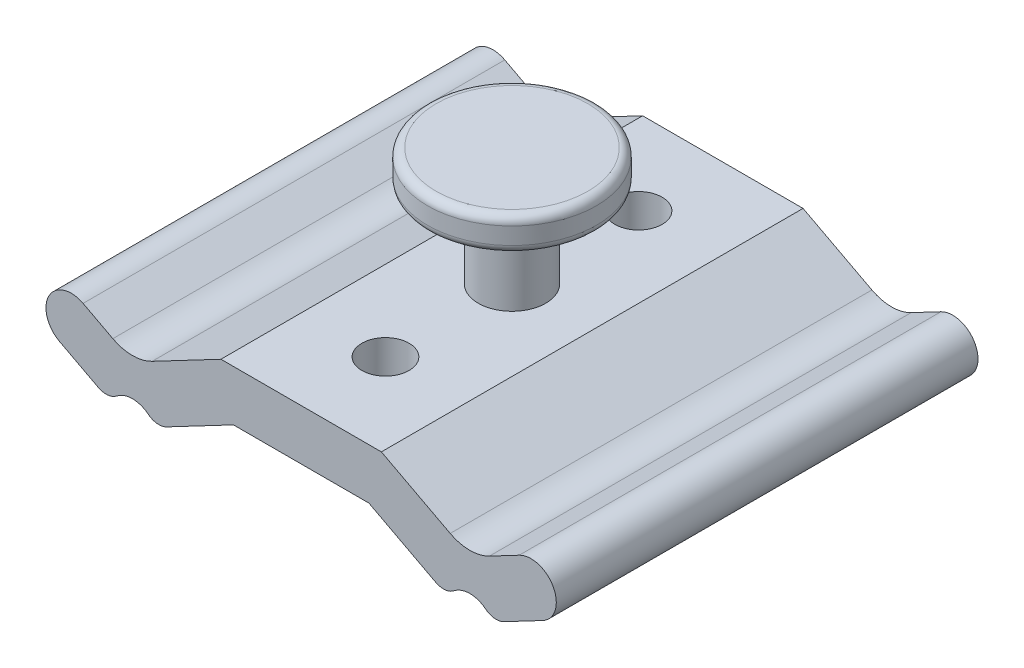
ISO-10303-21;
HEADER;
FILE_DESCRIPTION(('STEP AP214'),'2;1');
FILE_NAME('part.step','',(''),(''),'','','');
FILE_SCHEMA(('AUTOMOTIVE_DESIGN { 1 0 10303 214 1 1 1 1 }'));
ENDSEC;
DATA;
#1=APPLICATION_CONTEXT('core data for automotive mechanical design processes');
#2=APPLICATION_PROTOCOL_DEFINITION('international standard','automotive_design',2000,#1);
#3=PRODUCT_CONTEXT('',#1,'mechanical');
#4=PRODUCT('Part','Part','',(#3));
#5=PRODUCT_RELATED_PRODUCT_CATEGORY('part','',(#4));
#6=PRODUCT_DEFINITION_FORMATION('','',#4);
#7=PRODUCT_DEFINITION_CONTEXT('part definition',#1,'design');
#8=PRODUCT_DEFINITION('design','',#6,#7);
#9=PRODUCT_DEFINITION_SHAPE('','',#8);
#10=(LENGTH_UNIT() NAMED_UNIT(*) SI_UNIT(.MILLI.,.METRE.));
#11=(NAMED_UNIT(*) PLANE_ANGLE_UNIT() SI_UNIT($,.RADIAN.));
#12=(NAMED_UNIT(*) SI_UNIT($,.STERADIAN.) SOLID_ANGLE_UNIT());
#13=UNCERTAINTY_MEASURE_WITH_UNIT(LENGTH_MEASURE(1.E-05),#10,'distance_accuracy_value','');
#14=(GEOMETRIC_REPRESENTATION_CONTEXT(3) GLOBAL_UNCERTAINTY_ASSIGNED_CONTEXT((#13)) GLOBAL_UNIT_ASSIGNED_CONTEXT((#10,
#11,#12)) REPRESENTATION_CONTEXT('',''));
#15=CARTESIAN_POINT('',(0.,0.,0.));
#16=DIRECTION('',(0.,0.,1.));
#17=DIRECTION('',(1.,0.,0.));
#18=AXIS2_PLACEMENT_3D('',#15,#16,#17);
#19=CARTESIAN_POINT('',(27.253463647551,0.907317865991108,-25.));
#20=DIRECTION('',(0.,0.,-1.));
#21=DIRECTION('',(-1.,0.,0.));
#22=AXIS2_PLACEMENT_3D('',#19,#20,#21);
#23=CYLINDRICAL_SURFACE('',#22,3.);
#24=DIRECTION('',(0.,0.,1.));
#25=VECTOR('',#24,1.);
#26=CARTESIAN_POINT('',(28.6507242318909,-1.74742559797116,-25.));
#27=LINE('',#26,#25);
#28=CARTESIAN_POINT('',(28.6507242318909,-1.74742559797116,-25.));
#29=VERTEX_POINT('',#28);
#30=CARTESIAN_POINT('',(28.6507242318909,-1.74742559797116,25.));
#31=VERTEX_POINT('',#30);
#32=EDGE_CURVE('E292',#29,#31,#27,.T.);
#33=ORIENTED_EDGE('',*,*,#32,.F.);
#34=CARTESIAN_POINT('',(27.253463647551,0.907317865991108,-25.));
#35=DIRECTION('',(0.,0.,-1.));
#36=DIRECTION('',(-1.,0.,0.));
#37=AXIS2_PLACEMENT_3D('',#34,#35,#36);
#38=CIRCLE('',#37,3.);
#39=CARTESIAN_POINT('',(25.8562030632112,3.56206132995338,-25.));
#40=VERTEX_POINT('',#39);
#41=EDGE_CURVE('E298',#40,#29,#38,.T.);
#42=ORIENTED_EDGE('',*,*,#41,.F.);
#43=DIRECTION('',(0.,0.,-1.));
#44=VECTOR('',#43,1.);
#45=CARTESIAN_POINT('',(25.8562030632112,3.56206132995337,25.));
#46=LINE('',#45,#44);
#47=CARTESIAN_POINT('',(25.8562030632112,3.56206132995338,25.));
#48=VERTEX_POINT('',#47);
#49=EDGE_CURVE('E295',#48,#40,#46,.T.);
#50=ORIENTED_EDGE('',*,*,#49,.F.);
#51=CARTESIAN_POINT('',(27.253463647551,0.907317865991108,25.));
#52=DIRECTION('',(0.,0.,-1.));
#53=DIRECTION('',(-1.,0.,0.));
#54=AXIS2_PLACEMENT_3D('',#51,#52,#53);
#55=CIRCLE('',#54,3.);
#56=EDGE_CURVE('E301',#31,#48,#55,.F.);
#57=ORIENTED_EDGE('',*,*,#56,.F.);
#58=EDGE_LOOP('',(#33,#42,#50,#57));
#59=FACE_BOUND('',#58,.T.);
#60=ADVANCED_FACE('F36',(#59),#23,.T.);
#61=CARTESIAN_POINT('',(20.,-6.30052692745849,25.));
#62=DIRECTION('',(-0.465753528113271,0.884914487987422,0.));
#63=DIRECTION('',(-0.884914487987422,-0.465753528113271,0.));
#64=AXIS2_PLACEMENT_3D('',#61,#62,#63);
#65=PLANE('',#64);
#66=DIRECTION('',(0.884914487987422,0.465753528113271,0.));
#67=VECTOR('',#66,1.);
#68=CARTESIAN_POINT('',(20.,-6.30052692745849,25.));
#69=LINE('',#68,#67);
#70=CARTESIAN_POINT('',(24.0551876247654,-4.16617612968668,25.));
#71=VERTEX_POINT('',#70);
#72=EDGE_CURVE('E266',#71,#31,#69,.T.);
#73=ORIENTED_EDGE('',*,*,#72,.F.);
#74=DIRECTION('',(0.,0.,1.));
#75=VECTOR('',#74,1.);
#76=CARTESIAN_POINT('',(24.0551876247654,-4.16617612968668,25.));
#77=LINE('',#76,#75);
#78=CARTESIAN_POINT('',(24.0551876247654,-4.16617612968668,-25.));
#79=VERTEX_POINT('',#78);
#80=EDGE_CURVE('E303',#71,#79,#77,.F.);
#81=ORIENTED_EDGE('',*,*,#80,.T.);
#82=DIRECTION('',(0.884914487987422,0.465753528113271,0.));
#83=VECTOR('',#82,1.);
#84=CARTESIAN_POINT('',(20.,-6.30052692745849,-25.));
#85=LINE('',#84,#83);
#86=EDGE_CURVE('E255',#79,#29,#85,.T.);
#87=ORIENTED_EDGE('',*,*,#86,.T.);
#88=ORIENTED_EDGE('',*,*,#32,.T.);
#89=EDGE_LOOP('',(#73,#81,#87,#88));
#90=FACE_BOUND('',#89,.T.);
#91=ADVANCED_FACE('F362',(#90),#65,.F.);
#92=CARTESIAN_POINT('',(17.2054788313204,-0.991039999533956,25.));
#93=DIRECTION('',(-0.465753528113271,0.884914487987422,0.));
#94=DIRECTION('',(-0.884914487987422,-0.465753528113271,0.));
#95=AXIS2_PLACEMENT_3D('',#92,#93,#94);
#96=PLANE('',#95);
#97=DIRECTION('',(0.884914487987422,0.465753528113271,0.));
#98=VECTOR('',#97,1.);
#99=CARTESIAN_POINT('',(17.2054788313204,-0.991039999533956,25.));
#100=LINE('',#99,#98);
#101=CARTESIAN_POINT('',(22.3287676405664,1.70548025280874,25.));
#102=VERTEX_POINT('',#101);
#103=EDGE_CURVE('E268',#102,#48,#100,.T.);
#104=ORIENTED_EDGE('',*,*,#103,.T.);
#105=ORIENTED_EDGE('',*,*,#49,.T.);
#106=DIRECTION('',(0.884914487987422,0.465753528113271,0.));
#107=VECTOR('',#106,1.);
#108=CARTESIAN_POINT('',(17.2054788313204,-0.991039999533956,-25.));
#109=LINE('',#108,#107);
#110=CARTESIAN_POINT('',(22.3287676405664,1.70548025280874,-25.));
#111=VERTEX_POINT('',#110);
#112=EDGE_CURVE('E257',#111,#40,#109,.T.);
#113=ORIENTED_EDGE('',*,*,#112,.F.);
#114=DIRECTION('',(0.,0.,-1.));
#115=VECTOR('',#114,1.);
#116=CARTESIAN_POINT('',(22.3287676405664,1.70548025280874,25.));
#117=LINE('',#116,#115);
#118=EDGE_CURVE('E286',#111,#102,#117,.F.);
#119=ORIENTED_EDGE('',*,*,#118,.T.);
#120=EDGE_LOOP('',(#104,#105,#113,#119));
#121=FACE_BOUND('',#120,.T.);
#122=ADVANCED_FACE('F368',(#121),#96,.T.);
#123=CARTESIAN_POINT('',(10.823752889911,5.30948692792453,25.));
#124=DIRECTION('',(0.465753528113271,0.884914487987422,0.));
#125=DIRECTION('',(-0.884914487987422,0.465753528113271,0.));
#126=AXIS2_PLACEMENT_3D('',#123,#124,#125);
#127=PLANE('',#126);
#128=DIRECTION('',(0.884914487987422,-0.465753528113271,0.));
#129=VECTOR('',#128,1.);
#130=CARTESIAN_POINT('',(10.823752889911,5.30948692792453,25.));
#131=LINE('',#130,#129);
#132=CARTESIAN_POINT('',(9.51180357607636,6.,25.));
#133=VERTEX_POINT('',#132);
#134=CARTESIAN_POINT('',(17.6712323594336,1.70548025280874,25.));
#135=VERTEX_POINT('',#134);
#136=EDGE_CURVE('E271',#133,#135,#131,.T.);
#137=ORIENTED_EDGE('',*,*,#136,.T.);
#138=DIRECTION('',(0.,0.,-1.));
#139=VECTOR('',#138,1.);
#140=CARTESIAN_POINT('',(17.6712323594336,1.70548025280874,-25.));
#141=LINE('',#140,#139);
#142=CARTESIAN_POINT('',(17.6712323594336,1.70548025280874,-25.));
#143=VERTEX_POINT('',#142);
#144=EDGE_CURVE('E283',#135,#143,#141,.T.);
#145=ORIENTED_EDGE('',*,*,#144,.T.);
#146=DIRECTION('',(0.884914487987422,-0.465753528113271,0.));
#147=VECTOR('',#146,1.);
#148=CARTESIAN_POINT('',(10.823752889911,5.30948692792453,-25.));
#149=LINE('',#148,#147);
#150=CARTESIAN_POINT('',(9.51180357607636,6.,-25.));
#151=VERTEX_POINT('',#150);
#152=EDGE_CURVE('E186',#151,#143,#149,.T.);
#153=ORIENTED_EDGE('',*,*,#152,.F.);
#154=DIRECTION('',(0.,0.,-1.));
#155=VECTOR('',#154,1.);
#156=CARTESIAN_POINT('',(9.51180357607636,6.,25.));
#157=LINE('',#156,#155);
#158=EDGE_CURVE('E181',#133,#151,#157,.T.);
#159=ORIENTED_EDGE('',*,*,#158,.F.);
#160=EDGE_LOOP('',(#137,#145,#153,#159));
#161=FACE_BOUND('',#160,.T.);
#162=ADVANCED_FACE('F469',(#161),#127,.T.);
#163=CARTESIAN_POINT('',(0.,6.,25.));
#164=DIRECTION('',(0.,1.,0.));
#165=DIRECTION('',(-1.,0.,0.));
#166=AXIS2_PLACEMENT_3D('',#163,#164,#165);
#167=PLANE('',#166);
#168=CARTESIAN_POINT('',(0.,6.,0.));
#169=DIRECTION('',(0.,1.,0.));
#170=DIRECTION('',(-1.,0.,0.));
#171=AXIS2_PLACEMENT_3D('',#168,#169,#170);
#172=CIRCLE('',#171,4.);
#173=CARTESIAN_POINT('',(-4.,6.,0.));
#174=VERTEX_POINT('',#173);
#175=EDGE_CURVE('E319',#174,#174,#172,.T.);
#176=ORIENTED_EDGE('',*,*,#175,.F.);
#177=EDGE_LOOP('',(#176));
#178=FACE_BOUND('',#177,.T.);
#179=CARTESIAN_POINT('',(0.,6.,-15.));
#180=DIRECTION('',(0.,1.,0.));
#181=DIRECTION('',(0.,0.,1.));
#182=AXIS2_PLACEMENT_3D('',#179,#180,#181);
#183=CIRCLE('',#182,2.80000000000001);
#184=CARTESIAN_POINT('',(0.,6.,-12.2));
#185=VERTEX_POINT('',#184);
#186=EDGE_CURVE('E324',#185,#185,#183,.T.);
#187=ORIENTED_EDGE('',*,*,#186,.F.);
#188=EDGE_LOOP('',(#187));
#189=FACE_BOUND('',#188,.T.);
#190=CARTESIAN_POINT('',(0.,6.,15.));
#191=DIRECTION('',(0.,1.,0.));
#192=DIRECTION('',(0.,0.,1.));
#193=AXIS2_PLACEMENT_3D('',#190,#191,#192);
#194=CIRCLE('',#193,2.80000000000001);
#195=CARTESIAN_POINT('',(0.,6.,17.8));
#196=VERTEX_POINT('',#195);
#197=EDGE_CURVE('E323',#196,#196,#194,.T.);
#198=ORIENTED_EDGE('',*,*,#197,.F.);
#199=EDGE_LOOP('',(#198));
#200=FACE_BOUND('',#199,.T.);
#201=ORIENTED_EDGE('',*,*,#158,.T.);
#202=DIRECTION('',(1.,0.,0.));
#203=VECTOR('',#202,1.);
#204=CARTESIAN_POINT('',(0.,6.,-25.));
#205=LINE('',#204,#203);
#206=CARTESIAN_POINT('',(-9.51180357607636,6.,-25.));
#207=VERTEX_POINT('',#206);
#208=EDGE_CURVE('E174',#207,#151,#205,.T.);
#209=ORIENTED_EDGE('',*,*,#208,.F.);
#210=DIRECTION('',(0.,0.,-1.));
#211=VECTOR('',#210,1.);
#212=CARTESIAN_POINT('',(-9.51180357607636,6.,25.));
#213=LINE('',#212,#211);
#214=CARTESIAN_POINT('',(-9.51180357607636,6.,25.));
#215=VERTEX_POINT('',#214);
#216=EDGE_CURVE('E179',#215,#207,#213,.T.);
#217=ORIENTED_EDGE('',*,*,#216,.F.);
#218=DIRECTION('',(1.,0.,0.));
#219=VECTOR('',#218,1.);
#220=CARTESIAN_POINT('',(0.,6.,25.));
#221=LINE('',#220,#219);
#222=EDGE_CURVE('E274',#215,#133,#221,.T.);
#223=ORIENTED_EDGE('',*,*,#222,.T.);
#224=EDGE_LOOP('',(#201,#209,#217,#223));
#225=FACE_BOUND('',#224,.T.);
#226=ADVANCED_FACE('F176',(#178,#189,#200,#225),#167,.T.);
#227=CARTESIAN_POINT('',(0.,0.,25.));
#228=DIRECTION('',(0.,1.,0.));
#229=DIRECTION('',(-1.,0.,0.));
#230=AXIS2_PLACEMENT_3D('',#227,#228,#229);
#231=PLANE('',#230);
#232=CARTESIAN_POINT('',(0.,0.,-15.));
#233=DIRECTION('',(0.,1.,0.));
#234=DIRECTION('',(-1.,0.,0.));
#235=AXIS2_PLACEMENT_3D('',#232,#233,#234);
#236=CIRCLE('',#235,2.80000000000001);
#237=CARTESIAN_POINT('',(-2.80000000000002,0.,-15.));
#238=VERTEX_POINT('',#237);
#239=EDGE_CURVE('E320',#238,#238,#236,.T.);
#240=ORIENTED_EDGE('',*,*,#239,.T.);
#241=EDGE_LOOP('',(#240));
#242=FACE_BOUND('',#241,.T.);
#243=CARTESIAN_POINT('',(0.,0.,15.));
#244=DIRECTION('',(0.,1.,0.));
#245=DIRECTION('',(-1.,0.,0.));
#246=AXIS2_PLACEMENT_3D('',#243,#244,#245);
#247=CIRCLE('',#246,2.80000000000001);
#248=CARTESIAN_POINT('',(-2.80000000000001,0.,15.));
#249=VERTEX_POINT('',#248);
#250=EDGE_CURVE('E413',#249,#249,#247,.T.);
#251=ORIENTED_EDGE('',*,*,#250,.T.);
#252=EDGE_LOOP('',(#251));
#253=FACE_BOUND('',#252,.T.);
#254=DIRECTION('',(1.,0.,0.));
#255=VECTOR('',#254,1.);
#256=CARTESIAN_POINT('',(0.,0.,25.));
#257=LINE('',#256,#255);
#258=CARTESIAN_POINT('',(-8.02923172123142,0.,25.));
#259=VERTEX_POINT('',#258);
#260=CARTESIAN_POINT('',(8.02923172123142,0.,25.));
#261=VERTEX_POINT('',#260);
#262=EDGE_CURVE('E276',#259,#261,#257,.T.);
#263=ORIENTED_EDGE('',*,*,#262,.F.);
#264=DIRECTION('',(0.,0.,-1.));
#265=VECTOR('',#264,1.);
#266=CARTESIAN_POINT('',(-8.02923172123142,0.,25.));
#267=LINE('',#266,#265);
#268=CARTESIAN_POINT('',(-8.02923172123142,0.,-25.));
#269=VERTEX_POINT('',#268);
#270=EDGE_CURVE('E204',#259,#269,#267,.T.);
#271=ORIENTED_EDGE('',*,*,#270,.T.);
#272=DIRECTION('',(1.,0.,0.));
#273=VECTOR('',#272,1.);
#274=CARTESIAN_POINT('',(0.,0.,-25.));
#275=LINE('',#274,#273);
#276=CARTESIAN_POINT('',(8.02923172123142,0.,-25.));
#277=VERTEX_POINT('',#276);
#278=EDGE_CURVE('E185',#269,#277,#275,.T.);
#279=ORIENTED_EDGE('',*,*,#278,.T.);
#280=DIRECTION('',(0.,0.,-1.));
#281=VECTOR('',#280,1.);
#282=CARTESIAN_POINT('',(8.02923172123142,0.,25.));
#283=LINE('',#282,#281);
#284=EDGE_CURVE('E280',#261,#277,#283,.T.);
#285=ORIENTED_EDGE('',*,*,#284,.F.);
#286=EDGE_LOOP('',(#263,#271,#279,#285));
#287=FACE_BOUND('',#286,.T.);
#288=ADVANCED_FACE('F448',(#242,#253,#287),#231,.F.);
#289=CARTESIAN_POINT('',(8.02923172123142,0.,25.));
#290=DIRECTION('',(0.465753528113271,0.884914487987422,0.));
#291=DIRECTION('',(-0.884914487987422,0.465753528113271,0.));
#292=AXIS2_PLACEMENT_3D('',#289,#290,#291);
#293=PLANE('',#292);
#294=DIRECTION('',(0.884914487987422,-0.465753528113271,0.));
#295=VECTOR('',#294,1.);
#296=CARTESIAN_POINT('',(8.02923172123142,0.,-25.));
#297=LINE('',#296,#295);
#298=CARTESIAN_POINT('',(15.9448123752346,-4.16617612968668,-25.));
#299=VERTEX_POINT('',#298);
#300=EDGE_CURVE('E263',#277,#299,#297,.T.);
#301=ORIENTED_EDGE('',*,*,#300,.T.);
#302=DIRECTION('',(0.,0.,1.));
#303=VECTOR('',#302,1.);
#304=CARTESIAN_POINT('',(15.9448123752346,-4.16617612968668,25.));
#305=LINE('',#304,#303);
#306=CARTESIAN_POINT('',(15.9448123752346,-4.16617612968668,25.));
#307=VERTEX_POINT('',#306);
#308=EDGE_CURVE('E317',#299,#307,#305,.T.);
#309=ORIENTED_EDGE('',*,*,#308,.T.);
#310=DIRECTION('',(0.884914487987422,-0.465753528113271,0.));
#311=VECTOR('',#310,1.);
#312=CARTESIAN_POINT('',(8.02923172123142,0.,25.));
#313=LINE('',#312,#311);
#314=EDGE_CURVE('E278',#261,#307,#313,.T.);
#315=ORIENTED_EDGE('',*,*,#314,.F.);
#316=ORIENTED_EDGE('',*,*,#284,.T.);
#317=EDGE_LOOP('',(#301,#309,#315,#316));
#318=FACE_BOUND('',#317,.T.);
#319=ADVANCED_FACE('F451',(#318),#293,.F.);
#320=CARTESIAN_POINT('',(0.,0.,25.));
#321=DIRECTION('',(0.,0.,-1.));
#322=DIRECTION('',(-1.,0.,0.));
#323=AXIS2_PLACEMENT_3D('',#320,#321,#322);
#324=PLANE('',#323);
#325=CARTESIAN_POINT('',(20.,-6.30052692745849,25.));
#326=DIRECTION('',(0.,0.,1.));
#327=DIRECTION('',(1.,0.,0.));
#328=AXIS2_PLACEMENT_3D('',#325,#326,#327);
#329=CIRCLE('',#328,3.);
#330=CARTESIAN_POINT('',(21.8742083411233,-3.9580190632105,25.));
#331=VERTEX_POINT('',#330);
#332=CARTESIAN_POINT('',(18.1257916588767,-3.9580190632105,25.));
#333=VERTEX_POINT('',#332);
#334=EDGE_CURVE('E250',#331,#333,#329,.T.);
#335=ORIENTED_EDGE('',*,*,#334,.F.);
#336=CARTESIAN_POINT('',(23.1236805685389,-2.39634715371184,25.));
#337=DIRECTION('',(0.,0.,-1.));
#338=DIRECTION('',(-1.,0.,0.));
#339=AXIS2_PLACEMENT_3D('',#336,#337,#338);
#340=CIRCLE('',#339,2.);
#341=EDGE_CURVE('E315',#331,#71,#340,.F.);
#342=ORIENTED_EDGE('',*,*,#341,.T.);
#343=ORIENTED_EDGE('',*,*,#72,.T.);
#344=ORIENTED_EDGE('',*,*,#56,.T.);
#345=ORIENTED_EDGE('',*,*,#103,.F.);
#346=CARTESIAN_POINT('',(20.,6.13005269274585,25.));
#347=DIRECTION('',(0.,0.,-1.));
#348=DIRECTION('',(-1.,0.,0.));
#349=AXIS2_PLACEMENT_3D('',#346,#347,#348);
#350=CIRCLE('',#349,5.);
#351=EDGE_CURVE('E290',#102,#135,#350,.T.);
#352=ORIENTED_EDGE('',*,*,#351,.T.);
#353=ORIENTED_EDGE('',*,*,#136,.F.);
#354=ORIENTED_EDGE('',*,*,#222,.F.);
#355=DIRECTION('',(-0.884914487987422,-0.465753528113271,0.));
#356=VECTOR('',#355,1.);
#357=CARTESIAN_POINT('',(-10.823752889911,5.30948692792453,25.));
#358=LINE('',#357,#356);
#359=CARTESIAN_POINT('',(-17.6712323594336,1.70548025280874,25.));
#360=VERTEX_POINT('',#359);
#361=EDGE_CURVE('E202',#215,#360,#358,.T.);
#362=ORIENTED_EDGE('',*,*,#361,.T.);
#363=CARTESIAN_POINT('',(-20.,6.13005269274585,25.));
#364=DIRECTION('',(0.,0.,1.));
#365=DIRECTION('',(1.,0.,0.));
#366=AXIS2_PLACEMENT_3D('',#363,#364,#365);
#367=CIRCLE('',#366,5.);
#368=CARTESIAN_POINT('',(-22.3287676405664,1.70548025280874,25.));
#369=VERTEX_POINT('',#368);
#370=EDGE_CURVE('E216',#369,#360,#367,.T.);
#371=ORIENTED_EDGE('',*,*,#370,.F.);
#372=DIRECTION('',(-0.884914487987422,0.465753528113271,0.));
#373=VECTOR('',#372,1.);
#374=CARTESIAN_POINT('',(-17.2054788313204,-0.991039999533956,25.));
#375=LINE('',#374,#373);
#376=CARTESIAN_POINT('',(-25.8562030632112,3.56206132995338,25.));
#377=VERTEX_POINT('',#376);
#378=EDGE_CURVE('E429',#369,#377,#375,.T.);
#379=ORIENTED_EDGE('',*,*,#378,.T.);
#380=CARTESIAN_POINT('',(-27.253463647551,0.907317865991108,25.));
#381=DIRECTION('',(0.,0.,1.));
#382=DIRECTION('',(1.,0.,0.));
#383=AXIS2_PLACEMENT_3D('',#380,#381,#382);
#384=CIRCLE('',#383,3.);
#385=CARTESIAN_POINT('',(-28.6507242318909,-1.74742559797116,25.));
#386=VERTEX_POINT('',#385);
#387=EDGE_CURVE('E227',#386,#377,#384,.F.);
#388=ORIENTED_EDGE('',*,*,#387,.F.);
#389=DIRECTION('',(-0.884914487987422,0.465753528113271,0.));
#390=VECTOR('',#389,1.);
#391=CARTESIAN_POINT('',(-20.,-6.30052692745849,25.));
#392=LINE('',#391,#390);
#393=CARTESIAN_POINT('',(-24.0551876247654,-4.16617612968668,25.));
#394=VERTEX_POINT('',#393);
#395=EDGE_CURVE('E427',#394,#386,#392,.T.);
#396=ORIENTED_EDGE('',*,*,#395,.F.);
#397=CARTESIAN_POINT('',(-23.1236805685389,-2.39634715371184,25.));
#398=DIRECTION('',(0.,0.,1.));
#399=DIRECTION('',(1.,0.,0.));
#400=AXIS2_PLACEMENT_3D('',#397,#398,#399);
#401=CIRCLE('',#400,2.);
#402=CARTESIAN_POINT('',(-21.8742083411233,-3.9580190632105,25.));
#403=VERTEX_POINT('',#402);
#404=EDGE_CURVE('E245',#403,#394,#401,.F.);
#405=ORIENTED_EDGE('',*,*,#404,.F.);
#406=CARTESIAN_POINT('',(-20.,-6.30052692745849,25.));
#407=DIRECTION('',(0.,0.,-1.));
#408=DIRECTION('',(-1.,0.,0.));
#409=AXIS2_PLACEMENT_3D('',#406,#407,#408);
#410=CIRCLE('',#409,3.);
#411=CARTESIAN_POINT('',(-18.1257916588767,-3.9580190632105,25.));
#412=VERTEX_POINT('',#411);
#413=EDGE_CURVE('E416',#403,#412,#410,.T.);
#414=ORIENTED_EDGE('',*,*,#413,.T.);
#415=CARTESIAN_POINT('',(-16.8763194314611,-2.39634715371184,25.));
#416=DIRECTION('',(0.,0.,1.));
#417=DIRECTION('',(1.,0.,0.));
#418=AXIS2_PLACEMENT_3D('',#415,#416,#417);
#419=CIRCLE('',#418,2.);
#420=CARTESIAN_POINT('',(-15.9448123752346,-4.16617612968668,25.));
#421=VERTEX_POINT('',#420);
#422=EDGE_CURVE('E242',#421,#412,#419,.F.);
#423=ORIENTED_EDGE('',*,*,#422,.F.);
#424=DIRECTION('',(-0.884914487987422,-0.465753528113271,0.));
#425=VECTOR('',#424,1.);
#426=CARTESIAN_POINT('',(-8.02923172123142,0.,25.));
#427=LINE('',#426,#425);
#428=EDGE_CURVE('E209',#259,#421,#427,.T.);
#429=ORIENTED_EDGE('',*,*,#428,.F.);
#430=ORIENTED_EDGE('',*,*,#262,.T.);
#431=ORIENTED_EDGE('',*,*,#314,.T.);
#432=CARTESIAN_POINT('',(16.8763194314611,-2.39634715371184,25.));
#433=DIRECTION('',(0.,0.,-1.));
#434=DIRECTION('',(-1.,0.,0.));
#435=AXIS2_PLACEMENT_3D('',#432,#433,#434);
#436=CIRCLE('',#435,2.);
#437=EDGE_CURVE('E51',#307,#333,#436,.F.);
#438=ORIENTED_EDGE('',*,*,#437,.T.);
#439=EDGE_LOOP('',(#335,#342,#343,#344,#345,#352,#353,#354,#362,#371,#379,#388,#396,#405,#414,
#423,#429,#430,#431,#438));
#440=FACE_BOUND('',#439,.T.);
#441=ADVANCED_FACE('F438',(#440),#324,.F.);
#442=CARTESIAN_POINT('',(0.,0.,-25.));
#443=DIRECTION('',(0.,0.,-1.));
#444=DIRECTION('',(-1.,0.,0.));
#445=AXIS2_PLACEMENT_3D('',#442,#443,#444);
#446=PLANE('',#445);
#447=ORIENTED_EDGE('',*,*,#86,.F.);
#448=CARTESIAN_POINT('',(23.1236805685389,-2.39634715371184,-25.));
#449=DIRECTION('',(0.,0.,-1.));
#450=DIRECTION('',(-1.,0.,0.));
#451=AXIS2_PLACEMENT_3D('',#448,#449,#450);
#452=CIRCLE('',#451,2.);
#453=CARTESIAN_POINT('',(21.8742083411233,-3.9580190632105,-25.));
#454=VERTEX_POINT('',#453);
#455=EDGE_CURVE('E308',#79,#454,#452,.T.);
#456=ORIENTED_EDGE('',*,*,#455,.T.);
#457=CARTESIAN_POINT('',(20.,-6.30052692745849,-25.));
#458=DIRECTION('',(0.,0.,1.));
#459=DIRECTION('',(1.,0.,0.));
#460=AXIS2_PLACEMENT_3D('',#457,#458,#459);
#461=CIRCLE('',#460,3.);
#462=CARTESIAN_POINT('',(18.1257916588767,-3.9580190632105,-25.));
#463=VERTEX_POINT('',#462);
#464=EDGE_CURVE('E252',#454,#463,#461,.T.);
#465=ORIENTED_EDGE('',*,*,#464,.T.);
#466=CARTESIAN_POINT('',(16.8763194314611,-2.39634715371184,-25.));
#467=DIRECTION('',(0.,0.,-1.));
#468=DIRECTION('',(-1.,0.,0.));
#469=AXIS2_PLACEMENT_3D('',#466,#467,#468);
#470=CIRCLE('',#469,2.);
#471=EDGE_CURVE('E306',#463,#299,#470,.T.);
#472=ORIENTED_EDGE('',*,*,#471,.T.);
#473=ORIENTED_EDGE('',*,*,#300,.F.);
#474=ORIENTED_EDGE('',*,*,#278,.F.);
#475=DIRECTION('',(-0.884914487987422,-0.465753528113271,0.));
#476=VECTOR('',#475,1.);
#477=CARTESIAN_POINT('',(-8.02923172123142,0.,-25.));
#478=LINE('',#477,#476);
#479=CARTESIAN_POINT('',(-15.9448123752346,-4.16617612968668,-25.));
#480=VERTEX_POINT('',#479);
#481=EDGE_CURVE('E197',#269,#480,#478,.T.);
#482=ORIENTED_EDGE('',*,*,#481,.T.);
#483=CARTESIAN_POINT('',(-16.8763194314611,-2.39634715371184,-25.));
#484=DIRECTION('',(0.,0.,1.));
#485=DIRECTION('',(1.,0.,0.));
#486=AXIS2_PLACEMENT_3D('',#483,#484,#485);
#487=CIRCLE('',#486,2.);
#488=CARTESIAN_POINT('',(-18.1257916588767,-3.9580190632105,-25.));
#489=VERTEX_POINT('',#488);
#490=EDGE_CURVE('E233',#489,#480,#487,.T.);
#491=ORIENTED_EDGE('',*,*,#490,.F.);
#492=CARTESIAN_POINT('',(-20.,-6.30052692745849,-25.));
#493=DIRECTION('',(0.,0.,-1.));
#494=DIRECTION('',(-1.,0.,0.));
#495=AXIS2_PLACEMENT_3D('',#492,#493,#494);
#496=CIRCLE('',#495,3.);
#497=CARTESIAN_POINT('',(-21.8742083411233,-3.9580190632105,-25.));
#498=VERTEX_POINT('',#497);
#499=EDGE_CURVE('E419',#498,#489,#496,.T.);
#500=ORIENTED_EDGE('',*,*,#499,.F.);
#501=CARTESIAN_POINT('',(-23.1236805685389,-2.39634715371184,-25.));
#502=DIRECTION('',(0.,0.,1.));
#503=DIRECTION('',(1.,0.,0.));
#504=AXIS2_PLACEMENT_3D('',#501,#502,#503);
#505=CIRCLE('',#504,2.);
#506=CARTESIAN_POINT('',(-24.0551876247654,-4.16617612968668,-25.));
#507=VERTEX_POINT('',#506);
#508=EDGE_CURVE('E235',#507,#498,#505,.T.);
#509=ORIENTED_EDGE('',*,*,#508,.F.);
#510=DIRECTION('',(-0.884914487987422,0.465753528113271,0.));
#511=VECTOR('',#510,1.);
#512=CARTESIAN_POINT('',(-20.,-6.30052692745849,-25.));
#513=LINE('',#512,#511);
#514=CARTESIAN_POINT('',(-28.6507242318909,-1.74742559797116,-25.));
#515=VERTEX_POINT('',#514);
#516=EDGE_CURVE('E422',#507,#515,#513,.T.);
#517=ORIENTED_EDGE('',*,*,#516,.T.);
#518=CARTESIAN_POINT('',(-27.253463647551,0.907317865991108,-25.));
#519=DIRECTION('',(0.,0.,1.));
#520=DIRECTION('',(1.,0.,0.));
#521=AXIS2_PLACEMENT_3D('',#518,#519,#520);
#522=CIRCLE('',#521,3.);
#523=CARTESIAN_POINT('',(-25.8562030632112,3.56206132995338,-25.));
#524=VERTEX_POINT('',#523);
#525=EDGE_CURVE('E224',#524,#515,#522,.T.);
#526=ORIENTED_EDGE('',*,*,#525,.F.);
#527=DIRECTION('',(-0.884914487987422,0.465753528113271,0.));
#528=VECTOR('',#527,1.);
#529=CARTESIAN_POINT('',(-17.2054788313204,-0.991039999533956,-25.));
#530=LINE('',#529,#528);
#531=CARTESIAN_POINT('',(-22.3287676405664,1.70548025280874,-25.));
#532=VERTEX_POINT('',#531);
#533=EDGE_CURVE('E198',#532,#524,#530,.T.);
#534=ORIENTED_EDGE('',*,*,#533,.F.);
#535=CARTESIAN_POINT('',(-20.,6.13005269274585,-25.));
#536=DIRECTION('',(0.,0.,1.));
#537=DIRECTION('',(1.,0.,0.));
#538=AXIS2_PLACEMENT_3D('',#535,#536,#537);
#539=CIRCLE('',#538,5.);
#540=CARTESIAN_POINT('',(-17.6712323594336,1.70548025280874,-25.));
#541=VERTEX_POINT('',#540);
#542=EDGE_CURVE('E193',#541,#532,#539,.F.);
#543=ORIENTED_EDGE('',*,*,#542,.F.);
#544=DIRECTION('',(-0.884914487987422,-0.465753528113271,0.));
#545=VECTOR('',#544,1.);
#546=CARTESIAN_POINT('',(-10.823752889911,5.30948692792453,-25.));
#547=LINE('',#546,#545);
#548=EDGE_CURVE('E189',#207,#541,#547,.T.);
#549=ORIENTED_EDGE('',*,*,#548,.F.);
#550=ORIENTED_EDGE('',*,*,#208,.T.);
#551=ORIENTED_EDGE('',*,*,#152,.T.);
#552=CARTESIAN_POINT('',(20.,6.13005269274585,-25.));
#553=DIRECTION('',(0.,0.,-1.));
#554=DIRECTION('',(-1.,0.,0.));
#555=AXIS2_PLACEMENT_3D('',#552,#553,#554);
#556=CIRCLE('',#555,5.);
#557=EDGE_CURVE('E288',#143,#111,#556,.F.);
#558=ORIENTED_EDGE('',*,*,#557,.T.);
#559=ORIENTED_EDGE('',*,*,#112,.T.);
#560=ORIENTED_EDGE('',*,*,#41,.T.);
#561=EDGE_LOOP('',(#447,#456,#465,#472,#473,#474,#482,#491,#500,#509,#517,#526,#534,#543,#549,
#550,#551,#558,#559,#560));
#562=FACE_BOUND('',#561,.T.);
#563=ADVANCED_FACE('F191',(#562),#446,.T.);
#564=CARTESIAN_POINT('',(20.,6.13005269274585,25.));
#565=DIRECTION('',(0.,0.,1.));
#566=DIRECTION('',(1.,0.,0.));
#567=AXIS2_PLACEMENT_3D('',#564,#565,#566);
#568=CYLINDRICAL_SURFACE('',#567,5.);
#569=ORIENTED_EDGE('',*,*,#351,.F.);
#570=ORIENTED_EDGE('',*,*,#118,.F.);
#571=ORIENTED_EDGE('',*,*,#557,.F.);
#572=ORIENTED_EDGE('',*,*,#144,.F.);
#573=EDGE_LOOP('',(#569,#570,#571,#572));
#574=FACE_BOUND('',#573,.T.);
#575=ADVANCED_FACE('F377',(#574),#568,.F.);
#576=CARTESIAN_POINT('',(20.,-6.30052692745849,-25.));
#577=DIRECTION('',(0.,0.,1.));
#578=DIRECTION('',(1.,0.,0.));
#579=AXIS2_PLACEMENT_3D('',#576,#577,#578);
#580=CYLINDRICAL_SURFACE('',#579,3.);
#581=ORIENTED_EDGE('',*,*,#464,.F.);
#582=DIRECTION('',(0.,0.,1.));
#583=VECTOR('',#582,1.);
#584=CARTESIAN_POINT('',(21.8742083411233,-3.9580190632105,-25.));
#585=LINE('',#584,#583);
#586=EDGE_CURVE('E312',#454,#331,#585,.T.);
#587=ORIENTED_EDGE('',*,*,#586,.T.);
#588=ORIENTED_EDGE('',*,*,#334,.T.);
#589=DIRECTION('',(0.,0.,1.));
#590=VECTOR('',#589,1.);
#591=CARTESIAN_POINT('',(18.1257916588767,-3.9580190632105,-25.));
#592=LINE('',#591,#590);
#593=EDGE_CURVE('E310',#333,#463,#592,.F.);
#594=ORIENTED_EDGE('',*,*,#593,.T.);
#595=EDGE_LOOP('',(#581,#587,#588,#594));
#596=FACE_BOUND('',#595,.T.);
#597=ADVANCED_FACE('F382',(#596),#580,.F.);
#598=CARTESIAN_POINT('',(23.1236805685389,-2.39634715371184,-25.));
#599=DIRECTION('',(0.,0.,1.));
#600=DIRECTION('',(1.,0.,0.));
#601=AXIS2_PLACEMENT_3D('',#598,#599,#600);
#602=CYLINDRICAL_SURFACE('',#601,2.);
#603=ORIENTED_EDGE('',*,*,#341,.F.);
#604=ORIENTED_EDGE('',*,*,#586,.F.);
#605=ORIENTED_EDGE('',*,*,#455,.F.);
#606=ORIENTED_EDGE('',*,*,#80,.F.);
#607=EDGE_LOOP('',(#603,#604,#605,#606));
#608=FACE_BOUND('',#607,.T.);
#609=ADVANCED_FACE('F378',(#608),#602,.T.);
#610=CARTESIAN_POINT('',(16.8763194314611,-2.39634715371184,-25.));
#611=DIRECTION('',(0.,0.,1.));
#612=DIRECTION('',(1.,0.,0.));
#613=AXIS2_PLACEMENT_3D('',#610,#611,#612);
#614=CYLINDRICAL_SURFACE('',#613,2.);
#615=ORIENTED_EDGE('',*,*,#471,.F.);
#616=ORIENTED_EDGE('',*,*,#593,.F.);
#617=ORIENTED_EDGE('',*,*,#437,.F.);
#618=ORIENTED_EDGE('',*,*,#308,.F.);
#619=EDGE_LOOP('',(#615,#616,#617,#618));
#620=FACE_BOUND('',#619,.T.);
#621=ADVANCED_FACE('F381',(#620),#614,.T.);
#622=CARTESIAN_POINT('',(-27.253463647551,0.907317865991108,-25.));
#623=DIRECTION('',(0.,0.,-1.));
#624=DIRECTION('',(1.,0.,0.));
#625=AXIS2_PLACEMENT_3D('',#622,#623,#624);
#626=CYLINDRICAL_SURFACE('',#625,3.);
#627=DIRECTION('',(0.,0.,1.));
#628=VECTOR('',#627,1.);
#629=CARTESIAN_POINT('',(-28.6507242318909,-1.74742559797116,-25.));
#630=LINE('',#629,#628);
#631=EDGE_CURVE('E218',#515,#386,#630,.T.);
#632=ORIENTED_EDGE('',*,*,#631,.T.);
#633=ORIENTED_EDGE('',*,*,#387,.T.);
#634=DIRECTION('',(0.,0.,-1.));
#635=VECTOR('',#634,1.);
#636=CARTESIAN_POINT('',(-25.8562030632112,3.56206132995337,25.));
#637=LINE('',#636,#635);
#638=EDGE_CURVE('E221',#377,#524,#637,.T.);
#639=ORIENTED_EDGE('',*,*,#638,.T.);
#640=ORIENTED_EDGE('',*,*,#525,.T.);
#641=EDGE_LOOP('',(#632,#633,#639,#640));
#642=FACE_BOUND('',#641,.T.);
#643=ADVANCED_FACE('F386',(#642),#626,.T.);
#644=CARTESIAN_POINT('',(-20.,-6.30052692745849,25.));
#645=DIRECTION('',(0.465753528113271,0.884914487987422,0.));
#646=DIRECTION('',(0.884914487987422,-0.465753528113271,0.));
#647=AXIS2_PLACEMENT_3D('',#644,#645,#646);
#648=PLANE('',#647);
#649=ORIENTED_EDGE('',*,*,#395,.T.);
#650=ORIENTED_EDGE('',*,*,#631,.F.);
#651=ORIENTED_EDGE('',*,*,#516,.F.);
#652=DIRECTION('',(0.,0.,1.));
#653=VECTOR('',#652,1.);
#654=CARTESIAN_POINT('',(-24.0551876247654,-4.16617612968668,25.));
#655=LINE('',#654,#653);
#656=EDGE_CURVE('E230',#394,#507,#655,.F.);
#657=ORIENTED_EDGE('',*,*,#656,.F.);
#658=EDGE_LOOP('',(#649,#650,#651,#657));
#659=FACE_BOUND('',#658,.T.);
#660=ADVANCED_FACE('F501',(#659),#648,.F.);
#661=CARTESIAN_POINT('',(-17.2054788313204,-0.991039999533956,25.));
#662=DIRECTION('',(0.465753528113271,0.884914487987422,0.));
#663=DIRECTION('',(0.884914487987422,-0.465753528113271,0.));
#664=AXIS2_PLACEMENT_3D('',#661,#662,#663);
#665=PLANE('',#664);
#666=ORIENTED_EDGE('',*,*,#378,.F.);
#667=DIRECTION('',(0.,0.,-1.));
#668=VECTOR('',#667,1.);
#669=CARTESIAN_POINT('',(-22.3287676405664,1.70548025280874,25.));
#670=LINE('',#669,#668);
#671=EDGE_CURVE('E206',#532,#369,#670,.F.);
#672=ORIENTED_EDGE('',*,*,#671,.F.);
#673=ORIENTED_EDGE('',*,*,#533,.T.);
#674=ORIENTED_EDGE('',*,*,#638,.F.);
#675=EDGE_LOOP('',(#666,#672,#673,#674));
#676=FACE_BOUND('',#675,.T.);
#677=ADVANCED_FACE('F509',(#676),#665,.T.);
#678=CARTESIAN_POINT('',(-10.823752889911,5.30948692792453,25.));
#679=DIRECTION('',(-0.465753528113271,0.884914487987422,0.));
#680=DIRECTION('',(0.884914487987422,0.465753528113271,0.));
#681=AXIS2_PLACEMENT_3D('',#678,#679,#680);
#682=PLANE('',#681);
#683=ORIENTED_EDGE('',*,*,#361,.F.);
#684=ORIENTED_EDGE('',*,*,#216,.T.);
#685=ORIENTED_EDGE('',*,*,#548,.T.);
#686=DIRECTION('',(0.,0.,-1.));
#687=VECTOR('',#686,1.);
#688=CARTESIAN_POINT('',(-17.6712323594336,1.70548025280874,-25.));
#689=LINE('',#688,#687);
#690=EDGE_CURVE('E203',#360,#541,#689,.T.);
#691=ORIENTED_EDGE('',*,*,#690,.F.);
#692=EDGE_LOOP('',(#683,#684,#685,#691));
#693=FACE_BOUND('',#692,.T.);
#694=ADVANCED_FACE('F200',(#693),#682,.T.);
#695=CARTESIAN_POINT('',(-8.02923172123142,0.,25.));
#696=DIRECTION('',(-0.465753528113271,0.884914487987422,0.));
#697=DIRECTION('',(0.884914487987422,0.465753528113271,0.));
#698=AXIS2_PLACEMENT_3D('',#695,#696,#697);
#699=PLANE('',#698);
#700=ORIENTED_EDGE('',*,*,#481,.F.);
#701=ORIENTED_EDGE('',*,*,#270,.F.);
#702=ORIENTED_EDGE('',*,*,#428,.T.);
#703=DIRECTION('',(0.,0.,1.));
#704=VECTOR('',#703,1.);
#705=CARTESIAN_POINT('',(-15.9448123752346,-4.16617612968668,25.));
#706=LINE('',#705,#704);
#707=EDGE_CURVE('E247',#480,#421,#706,.T.);
#708=ORIENTED_EDGE('',*,*,#707,.F.);
#709=EDGE_LOOP('',(#700,#701,#702,#708));
#710=FACE_BOUND('',#709,.T.);
#711=ADVANCED_FACE('F437',(#710),#699,.F.);
#712=CARTESIAN_POINT('',(-20.,6.13005269274585,25.));
#713=DIRECTION('',(0.,0.,1.));
#714=DIRECTION('',(-1.,0.,0.));
#715=AXIS2_PLACEMENT_3D('',#712,#713,#714);
#716=CYLINDRICAL_SURFACE('',#715,5.);
#717=ORIENTED_EDGE('',*,*,#370,.T.);
#718=ORIENTED_EDGE('',*,*,#690,.T.);
#719=ORIENTED_EDGE('',*,*,#542,.T.);
#720=ORIENTED_EDGE('',*,*,#671,.T.);
#721=EDGE_LOOP('',(#717,#718,#719,#720));
#722=FACE_BOUND('',#721,.T.);
#723=ADVANCED_FACE('F503',(#722),#716,.F.);
#724=CARTESIAN_POINT('',(-20.,-6.30052692745849,-25.));
#725=DIRECTION('',(0.,0.,1.));
#726=DIRECTION('',(-1.,0.,0.));
#727=AXIS2_PLACEMENT_3D('',#724,#725,#726);
#728=CYLINDRICAL_SURFACE('',#727,3.);
#729=ORIENTED_EDGE('',*,*,#499,.T.);
#730=DIRECTION('',(0.,0.,1.));
#731=VECTOR('',#730,1.);
#732=CARTESIAN_POINT('',(-18.1257916588767,-3.9580190632105,-25.));
#733=LINE('',#732,#731);
#734=EDGE_CURVE('E238',#412,#489,#733,.F.);
#735=ORIENTED_EDGE('',*,*,#734,.F.);
#736=ORIENTED_EDGE('',*,*,#413,.F.);
#737=DIRECTION('',(0.,0.,1.));
#738=VECTOR('',#737,1.);
#739=CARTESIAN_POINT('',(-21.8742083411233,-3.9580190632105,-25.));
#740=LINE('',#739,#738);
#741=EDGE_CURVE('E240',#498,#403,#740,.T.);
#742=ORIENTED_EDGE('',*,*,#741,.F.);
#743=EDGE_LOOP('',(#729,#735,#736,#742));
#744=FACE_BOUND('',#743,.T.);
#745=ADVANCED_FACE('F497',(#744),#728,.F.);
#746=CARTESIAN_POINT('',(-23.1236805685389,-2.39634715371184,-25.));
#747=DIRECTION('',(0.,0.,1.));
#748=DIRECTION('',(-1.,0.,0.));
#749=AXIS2_PLACEMENT_3D('',#746,#747,#748);
#750=CYLINDRICAL_SURFACE('',#749,2.);
#751=ORIENTED_EDGE('',*,*,#404,.T.);
#752=ORIENTED_EDGE('',*,*,#656,.T.);
#753=ORIENTED_EDGE('',*,*,#508,.T.);
#754=ORIENTED_EDGE('',*,*,#741,.T.);
#755=EDGE_LOOP('',(#751,#752,#753,#754));
#756=FACE_BOUND('',#755,.T.);
#757=ADVANCED_FACE('F494',(#756),#750,.T.);
#758=CARTESIAN_POINT('',(-16.8763194314611,-2.39634715371184,-25.));
#759=DIRECTION('',(0.,0.,1.));
#760=DIRECTION('',(-1.,0.,0.));
#761=AXIS2_PLACEMENT_3D('',#758,#759,#760);
#762=CYLINDRICAL_SURFACE('',#761,2.);
#763=ORIENTED_EDGE('',*,*,#490,.T.);
#764=ORIENTED_EDGE('',*,*,#707,.T.);
#765=ORIENTED_EDGE('',*,*,#422,.T.);
#766=ORIENTED_EDGE('',*,*,#734,.T.);
#767=EDGE_LOOP('',(#763,#764,#765,#766));
#768=FACE_BOUND('',#767,.T.);
#769=ADVANCED_FACE('F443',(#768),#762,.T.);
#770=CARTESIAN_POINT('',(0.,6.,15.));
#771=DIRECTION('',(0.,1.,0.));
#772=DIRECTION('',(0.,0.,1.));
#773=AXIS2_PLACEMENT_3D('',#770,#771,#772);
#774=CYLINDRICAL_SURFACE('',#773,2.80000000000001);
#775=ORIENTED_EDGE('',*,*,#197,.T.);
#776=EDGE_LOOP('',(#775));
#777=FACE_BOUND('',#776,.T.);
#778=ORIENTED_EDGE('',*,*,#250,.F.);
#779=EDGE_LOOP('',(#778));
#780=FACE_BOUND('',#779,.T.);
#781=ADVANCED_FACE('F493',(#777,#780),#774,.F.);
#782=CARTESIAN_POINT('',(0.,6.,-15.));
#783=DIRECTION('',(0.,1.,0.));
#784=DIRECTION('',(0.,0.,1.));
#785=AXIS2_PLACEMENT_3D('',#782,#783,#784);
#786=CYLINDRICAL_SURFACE('',#785,2.80000000000001);
#787=ORIENTED_EDGE('',*,*,#186,.T.);
#788=EDGE_LOOP('',(#787));
#789=FACE_BOUND('',#788,.T.);
#790=ORIENTED_EDGE('',*,*,#239,.F.);
#791=EDGE_LOOP('',(#790));
#792=FACE_BOUND('',#791,.T.);
#793=ADVANCED_FACE('F359',(#789,#792),#786,.F.);
#794=CARTESIAN_POINT('',(0.,20.,0.));
#795=DIRECTION('',(0.,1.,0.));
#796=DIRECTION('',(0.,0.,1.));
#797=AXIS2_PLACEMENT_3D('',#794,#795,#796);
#798=PLANE('',#797);
#799=CARTESIAN_POINT('',(0.,20.,0.));
#800=DIRECTION('',(0.,1.,0.));
#801=DIRECTION('',(0.,0.,1.));
#802=AXIS2_PLACEMENT_3D('',#799,#800,#801);
#803=CIRCLE('',#802,9.);
#804=CARTESIAN_POINT('',(0.,20.,9.));
#805=VERTEX_POINT('',#804);
#806=EDGE_CURVE('E44',#805,#805,#803,.T.);
#807=ORIENTED_EDGE('',*,*,#806,.T.);
#808=EDGE_LOOP('',(#807));
#809=FACE_BOUND('',#808,.T.);
#810=ADVANCED_FACE('F339',(#809),#798,.T.);
#811=CARTESIAN_POINT('',(0.,0.,0.));
#812=DIRECTION('',(0.,-1.,0.));
#813=DIRECTION('',(0.,0.,-1.));
#814=AXIS2_PLACEMENT_3D('',#811,#812,#813);
#815=CYLINDRICAL_SURFACE('',#814,10.);
#816=CARTESIAN_POINT('',(0.,17.,0.));
#817=DIRECTION('',(0.,-1.,0.));
#818=DIRECTION('',(0.,0.,-1.));
#819=AXIS2_PLACEMENT_3D('',#816,#817,#818);
#820=CIRCLE('',#819,10.);
#821=CARTESIAN_POINT('',(0.,17.,-10.));
#822=VERTEX_POINT('',#821);
#823=EDGE_CURVE('E334',#822,#822,#820,.F.);
#824=ORIENTED_EDGE('',*,*,#823,.T.);
#825=EDGE_LOOP('',(#824));
#826=FACE_BOUND('',#825,.T.);
#827=CARTESIAN_POINT('',(0.,19.,0.));
#828=DIRECTION('',(0.,1.,0.));
#829=DIRECTION('',(0.,0.,1.));
#830=AXIS2_PLACEMENT_3D('',#827,#828,#829);
#831=CIRCLE('',#830,10.);
#832=CARTESIAN_POINT('',(0.,19.,10.));
#833=VERTEX_POINT('',#832);
#834=EDGE_CURVE('E331',#833,#833,#831,.F.);
#835=ORIENTED_EDGE('',*,*,#834,.T.);
#836=EDGE_LOOP('',(#835));
#837=FACE_BOUND('',#836,.T.);
#838=ADVANCED_FACE('F347',(#826,#837),#815,.T.);
#839=CARTESIAN_POINT('',(10.,16.,0.));
#840=DIRECTION('',(0.,-1.,0.));
#841=DIRECTION('',(0.,0.,-1.));
#842=AXIS2_PLACEMENT_3D('',#839,#840,#841);
#843=PLANE('',#842);
#844=CARTESIAN_POINT('',(0.,16.,0.));
#845=DIRECTION('',(0.,-1.,0.));
#846=DIRECTION('',(0.,0.,-1.));
#847=AXIS2_PLACEMENT_3D('',#844,#845,#846);
#848=CIRCLE('',#847,9.);
#849=CARTESIAN_POINT('',(0.,16.,-9.));
#850=VERTEX_POINT('',#849);
#851=EDGE_CURVE('E328',#850,#850,#848,.T.);
#852=ORIENTED_EDGE('',*,*,#851,.T.);
#853=EDGE_LOOP('',(#852));
#854=FACE_BOUND('',#853,.T.);
#855=CARTESIAN_POINT('',(0.,16.,0.));
#856=DIRECTION('',(0.,-1.,0.));
#857=DIRECTION('',(0.,0.,-1.));
#858=AXIS2_PLACEMENT_3D('',#855,#856,#857);
#859=CIRCLE('',#858,5.);
#860=CARTESIAN_POINT('',(0.,16.,-5.));
#861=VERTEX_POINT('',#860);
#862=EDGE_CURVE('E325',#861,#861,#859,.F.);
#863=ORIENTED_EDGE('',*,*,#862,.T.);
#864=EDGE_LOOP('',(#863));
#865=FACE_BOUND('',#864,.T.);
#866=ADVANCED_FACE('F349',(#854,#865),#843,.T.);
#867=CARTESIAN_POINT('',(0.,0.,0.));
#868=DIRECTION('',(0.,-1.,0.));
#869=DIRECTION('',(0.,0.,-1.));
#870=AXIS2_PLACEMENT_3D('',#867,#868,#869);
#871=CYLINDRICAL_SURFACE('',#870,4.);
#872=CARTESIAN_POINT('',(0.,15.,0.));
#873=DIRECTION('',(0.,-1.,0.));
#874=DIRECTION('',(0.,0.,-1.));
#875=AXIS2_PLACEMENT_3D('',#872,#873,#874);
#876=CIRCLE('',#875,4.);
#877=CARTESIAN_POINT('',(0.,15.,-4.));
#878=VERTEX_POINT('',#877);
#879=EDGE_CURVE('E11',#878,#878,#876,.T.);
#880=ORIENTED_EDGE('',*,*,#879,.T.);
#881=EDGE_LOOP('',(#880));
#882=FACE_BOUND('',#881,.T.);
#883=ORIENTED_EDGE('',*,*,#175,.T.);
#884=EDGE_LOOP('',(#883));
#885=FACE_BOUND('',#884,.T.);
#886=ADVANCED_FACE('F356',(#882,#885),#871,.T.);
#887=CARTESIAN_POINT('',(0.,17.,0.));
#888=DIRECTION('',(0.,-1.,0.));
#889=DIRECTION('',(0.,0.,-1.));
#890=AXIS2_PLACEMENT_3D('',#887,#888,#889);
#891=TOROIDAL_SURFACE('',#890,9.,1.);
#892=ORIENTED_EDGE('',*,*,#823,.F.);
#893=EDGE_LOOP('',(#892));
#894=FACE_BOUND('',#893,.T.);
#895=ORIENTED_EDGE('',*,*,#851,.F.);
#896=EDGE_LOOP('',(#895));
#897=FACE_BOUND('',#896,.T.);
#898=ADVANCED_FACE('F344',(#894,#897),#891,.T.);
#899=CARTESIAN_POINT('',(0.,19.,0.));
#900=DIRECTION('',(0.,1.,0.));
#901=DIRECTION('',(0.,0.,1.));
#902=AXIS2_PLACEMENT_3D('',#899,#900,#901);
#903=TOROIDAL_SURFACE('',#902,9.,1.);
#904=ORIENTED_EDGE('',*,*,#806,.F.);
#905=EDGE_LOOP('',(#904));
#906=FACE_BOUND('',#905,.T.);
#907=ORIENTED_EDGE('',*,*,#834,.F.);
#908=EDGE_LOOP('',(#907));
#909=FACE_BOUND('',#908,.T.);
#910=ADVANCED_FACE('F341',(#906,#909),#903,.T.);
#911=CARTESIAN_POINT('',(0.,15.,0.));
#912=DIRECTION('',(0.,-1.,0.));
#913=DIRECTION('',(0.,0.,-1.));
#914=AXIS2_PLACEMENT_3D('',#911,#912,#913);
#915=TOROIDAL_SURFACE('',#914,5.,1.);
#916=ORIENTED_EDGE('',*,*,#862,.F.);
#917=EDGE_LOOP('',(#916));
#918=FACE_BOUND('',#917,.T.);
#919=ORIENTED_EDGE('',*,*,#879,.F.);
#920=EDGE_LOOP('',(#919));
#921=FACE_BOUND('',#920,.T.);
#922=ADVANCED_FACE('F38',(#918,#921),#915,.F.);
#923=CLOSED_SHELL('',(#60,#91,#122,#162,#226,#288,#319,#441,#563,#575,#597,#609,#621,#643,#660,
#677,#694,#711,#723,#745,#757,#769,#781,#793,#810,#838,#866,#886,#898,#910,#922));
#924=MANIFOLD_SOLID_BREP('B2',#923);
#925=ADVANCED_BREP_SHAPE_REPRESENTATION('',(#18,#924),#14);
#926=SHAPE_DEFINITION_REPRESENTATION(#9,#925);
ENDSEC;
END-ISO-10303-21;
